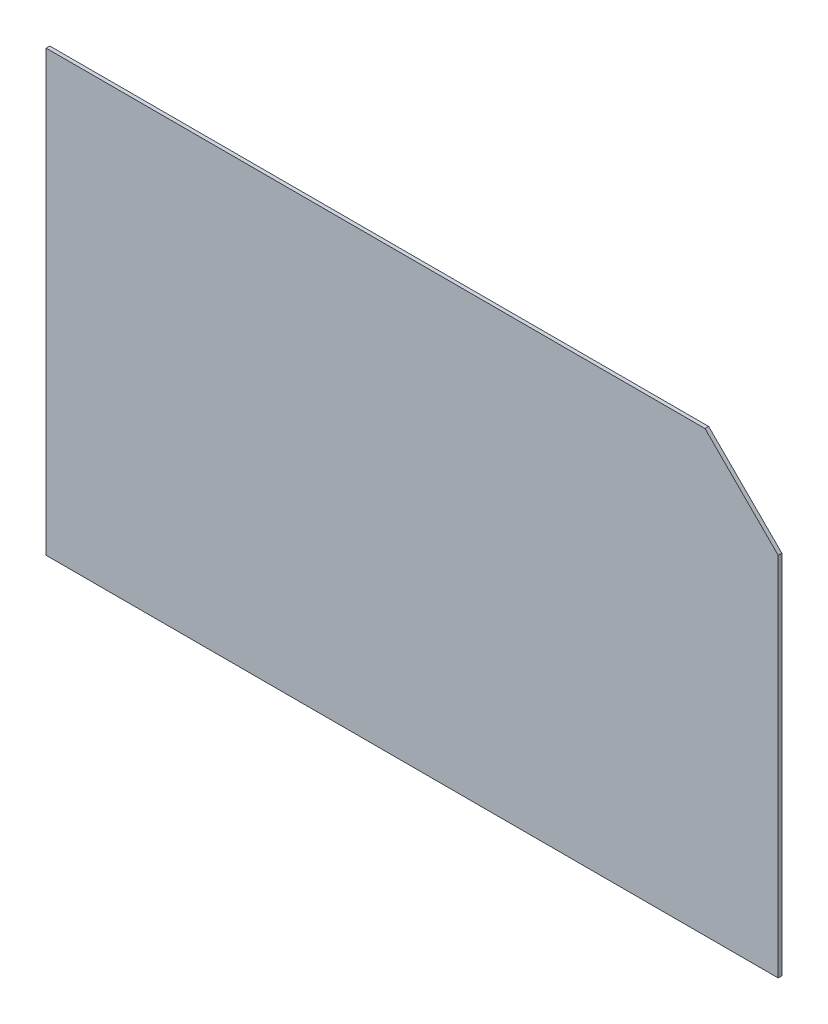
ISO-10303-21;
HEADER;
FILE_DESCRIPTION(('STEP AP214'),'2;1');
FILE_NAME('part.step','',(''),(''),'','','');
FILE_SCHEMA(('AUTOMOTIVE_DESIGN { 1 0 10303 214 1 1 1 1 }'));
ENDSEC;
DATA;
#1=APPLICATION_CONTEXT('core data for automotive mechanical design processes');
#2=APPLICATION_PROTOCOL_DEFINITION('international standard','automotive_design',2000,#1);
#3=PRODUCT_CONTEXT('',#1,'mechanical');
#4=PRODUCT('Part','Part','',(#3));
#5=PRODUCT_RELATED_PRODUCT_CATEGORY('part','',(#4));
#6=PRODUCT_DEFINITION_FORMATION('','',#4);
#7=PRODUCT_DEFINITION_CONTEXT('part definition',#1,'design');
#8=PRODUCT_DEFINITION('design','',#6,#7);
#9=PRODUCT_DEFINITION_SHAPE('','',#8);
#10=(LENGTH_UNIT() NAMED_UNIT(*) SI_UNIT(.MILLI.,.METRE.));
#11=(NAMED_UNIT(*) PLANE_ANGLE_UNIT() SI_UNIT($,.RADIAN.));
#12=(NAMED_UNIT(*) SI_UNIT($,.STERADIAN.) SOLID_ANGLE_UNIT());
#13=UNCERTAINTY_MEASURE_WITH_UNIT(LENGTH_MEASURE(1.E-05),#10,'distance_accuracy_value','');
#14=(GEOMETRIC_REPRESENTATION_CONTEXT(3) GLOBAL_UNCERTAINTY_ASSIGNED_CONTEXT((#13)) GLOBAL_UNIT_ASSIGNED_CONTEXT((#10,
#11,#12)) REPRESENTATION_CONTEXT('',''));
#15=CARTESIAN_POINT('',(0.,0.,0.));
#16=DIRECTION('',(0.,0.,1.));
#17=DIRECTION('',(1.,0.,0.));
#18=AXIS2_PLACEMENT_3D('',#15,#16,#17);
#19=CARTESIAN_POINT('',(-2105.89651022864,2647.412755716,-25.));
#20=DIRECTION('',(-1.,0.,0.));
#21=DIRECTION('',(0.,-1.,0.));
#22=AXIS2_PLACEMENT_3D('',#19,#20,#21);
#23=PLANE('',#22);
#24=DIRECTION('',(0.,-1.,0.));
#25=VECTOR('',#24,1.);
#26=CARTESIAN_POINT('',(-2105.89651022864,2647.412755716,0.));
#27=LINE('',#26,#25);
#28=CARTESIAN_POINT('',(-2105.89651022864,2647.412755716,0.));
#29=VERTEX_POINT('',#28);
#30=CARTESIAN_POINT('',(-2105.89651022864,-352.587244283995,0.));
#31=VERTEX_POINT('',#30);
#32=EDGE_CURVE('E119',#29,#31,#27,.T.);
#33=ORIENTED_EDGE('',*,*,#32,.F.);
#34=DIRECTION('',(0.,0.,1.));
#35=VECTOR('',#34,1.);
#36=CARTESIAN_POINT('',(-2105.89651022864,2647.412755716,-25.));
#37=LINE('',#36,#35);
#38=CARTESIAN_POINT('',(-2105.89651022864,2647.412755716,-25.));
#39=VERTEX_POINT('',#38);
#40=EDGE_CURVE('E11',#39,#29,#37,.T.);
#41=ORIENTED_EDGE('',*,*,#40,.F.);
#42=DIRECTION('',(0.,-1.,0.));
#43=VECTOR('',#42,1.);
#44=CARTESIAN_POINT('',(-2105.89651022864,2647.412755716,-25.));
#45=LINE('',#44,#43);
#46=CARTESIAN_POINT('',(-2105.89651022864,-352.587244283995,-25.));
#47=VERTEX_POINT('',#46);
#48=EDGE_CURVE('E117',#39,#47,#45,.T.);
#49=ORIENTED_EDGE('',*,*,#48,.T.);
#50=DIRECTION('',(0.,0.,1.));
#51=VECTOR('',#50,1.);
#52=CARTESIAN_POINT('',(-2105.89651022864,-352.587244283995,-25.));
#53=LINE('',#52,#51);
#54=EDGE_CURVE('E42',#47,#31,#53,.T.);
#55=ORIENTED_EDGE('',*,*,#54,.T.);
#56=EDGE_LOOP('',(#33,#41,#49,#55));
#57=FACE_BOUND('',#56,.T.);
#58=ADVANCED_FACE('F39',(#57),#23,.T.);
#59=CARTESIAN_POINT('',(-2105.89651022864,2647.412755716,-25.));
#60=DIRECTION('',(0.,1.,0.));
#61=DIRECTION('',(0.,0.,1.));
#62=AXIS2_PLACEMENT_3D('',#59,#60,#61);
#63=PLANE('',#62);
#64=DIRECTION('',(0.,0.,1.));
#65=VECTOR('',#64,1.);
#66=CARTESIAN_POINT('',(2394.10348977136,2647.412755716,-932.));
#67=LINE('',#66,#65);
#68=CARTESIAN_POINT('',(2394.10348977136,2647.412755716,-25.));
#69=VERTEX_POINT('',#68);
#70=CARTESIAN_POINT('',(2394.10348977136,2647.412755716,0.));
#71=VERTEX_POINT('',#70);
#72=EDGE_CURVE('E56',#69,#71,#67,.T.);
#73=ORIENTED_EDGE('',*,*,#72,.F.);
#74=DIRECTION('',(-1.,0.,0.));
#75=VECTOR('',#74,1.);
#76=CARTESIAN_POINT('',(-2105.89651022864,2647.412755716,-25.));
#77=LINE('',#76,#75);
#78=EDGE_CURVE('E63',#69,#39,#77,.T.);
#79=ORIENTED_EDGE('',*,*,#78,.T.);
#80=ORIENTED_EDGE('',*,*,#40,.T.);
#81=DIRECTION('',(-1.,0.,0.));
#82=VECTOR('',#81,1.);
#83=CARTESIAN_POINT('',(-2105.89651022864,2647.412755716,0.));
#84=LINE('',#83,#82);
#85=EDGE_CURVE('E81',#71,#29,#84,.T.);
#86=ORIENTED_EDGE('',*,*,#85,.F.);
#87=EDGE_LOOP('',(#73,#79,#80,#86));
#88=FACE_BOUND('',#87,.T.);
#89=ADVANCED_FACE('F146',(#88),#63,.T.);
#90=CARTESIAN_POINT('',(2894.10348977136,2647.412755716,-25.));
#91=DIRECTION('',(1.,0.,0.));
#92=DIRECTION('',(0.,0.,-1.));
#93=AXIS2_PLACEMENT_3D('',#90,#91,#92);
#94=PLANE('',#93);
#95=DIRECTION('',(0.,0.,1.));
#96=VECTOR('',#95,1.);
#97=CARTESIAN_POINT('',(2894.10348977136,2147.412755716,-932.));
#98=LINE('',#97,#96);
#99=CARTESIAN_POINT('',(2894.10348977136,2147.412755716,-25.));
#100=VERTEX_POINT('',#99);
#101=CARTESIAN_POINT('',(2894.10348977136,2147.412755716,0.));
#102=VERTEX_POINT('',#101);
#103=EDGE_CURVE('E96',#100,#102,#98,.T.);
#104=ORIENTED_EDGE('',*,*,#103,.T.);
#105=DIRECTION('',(0.,1.,0.));
#106=VECTOR('',#105,1.);
#107=CARTESIAN_POINT('',(2894.10348977136,2647.412755716,0.));
#108=LINE('',#107,#106);
#109=CARTESIAN_POINT('',(2894.10348977136,-352.587244283995,0.));
#110=VERTEX_POINT('',#109);
#111=EDGE_CURVE('E105',#110,#102,#108,.T.);
#112=ORIENTED_EDGE('',*,*,#111,.F.);
#113=DIRECTION('',(0.,0.,1.));
#114=VECTOR('',#113,1.);
#115=CARTESIAN_POINT('',(2894.10348977136,-352.587244283995,-25.));
#116=LINE('',#115,#114);
#117=CARTESIAN_POINT('',(2894.10348977136,-352.587244283995,-25.));
#118=VERTEX_POINT('',#117);
#119=EDGE_CURVE('E48',#118,#110,#116,.T.);
#120=ORIENTED_EDGE('',*,*,#119,.F.);
#121=DIRECTION('',(0.,1.,0.));
#122=VECTOR('',#121,1.);
#123=CARTESIAN_POINT('',(2894.10348977136,2647.412755716,-25.));
#124=LINE('',#123,#122);
#125=EDGE_CURVE('E108',#118,#100,#124,.T.);
#126=ORIENTED_EDGE('',*,*,#125,.T.);
#127=EDGE_LOOP('',(#104,#112,#120,#126));
#128=FACE_BOUND('',#127,.T.);
#129=ADVANCED_FACE('F104',(#128),#94,.T.);
#130=CARTESIAN_POINT('',(-2105.89651022864,-352.587244283995,-25.));
#131=DIRECTION('',(0.,-1.,0.));
#132=DIRECTION('',(0.,0.,-1.));
#133=AXIS2_PLACEMENT_3D('',#130,#131,#132);
#134=PLANE('',#133);
#135=DIRECTION('',(1.,0.,0.));
#136=VECTOR('',#135,1.);
#137=CARTESIAN_POINT('',(-2105.89651022864,-352.587244283995,0.));
#138=LINE('',#137,#136);
#139=EDGE_CURVE('E112',#31,#110,#138,.T.);
#140=ORIENTED_EDGE('',*,*,#139,.F.);
#141=ORIENTED_EDGE('',*,*,#54,.F.);
#142=DIRECTION('',(1.,0.,0.));
#143=VECTOR('',#142,1.);
#144=CARTESIAN_POINT('',(-2105.89651022864,-352.587244283995,-25.));
#145=LINE('',#144,#143);
#146=EDGE_CURVE('E130',#47,#118,#145,.T.);
#147=ORIENTED_EDGE('',*,*,#146,.T.);
#148=ORIENTED_EDGE('',*,*,#119,.T.);
#149=EDGE_LOOP('',(#140,#141,#147,#148));
#150=FACE_BOUND('',#149,.T.);
#151=ADVANCED_FACE('F143',(#150),#134,.T.);
#152=CARTESIAN_POINT('',(0.,0.,-25.));
#153=DIRECTION('',(0.,0.,1.));
#154=DIRECTION('',(1.,0.,0.));
#155=AXIS2_PLACEMENT_3D('',#152,#153,#154);
#156=PLANE('',#155);
#157=ORIENTED_EDGE('',*,*,#78,.F.);
#158=DIRECTION('',(0.707106781186544,-0.707106781186551,0.));
#159=VECTOR('',#158,1.);
#160=CARTESIAN_POINT('',(2520.7581227437,2520.75812274367,-25.));
#161=LINE('',#160,#159);
#162=EDGE_CURVE('E134',#69,#100,#161,.T.);
#163=ORIENTED_EDGE('',*,*,#162,.T.);
#164=ORIENTED_EDGE('',*,*,#125,.F.);
#165=ORIENTED_EDGE('',*,*,#146,.F.);
#166=ORIENTED_EDGE('',*,*,#48,.F.);
#167=EDGE_LOOP('',(#157,#163,#164,#165,#166));
#168=FACE_BOUND('',#167,.T.);
#169=ADVANCED_FACE('F145',(#168),#156,.F.);
#170=CARTESIAN_POINT('',(0.,0.,0.));
#171=DIRECTION('',(0.,0.,1.));
#172=DIRECTION('',(1.,0.,0.));
#173=AXIS2_PLACEMENT_3D('',#170,#171,#172);
#174=PLANE('',#173);
#175=DIRECTION('',(0.707106781186544,-0.707106781186551,0.));
#176=VECTOR('',#175,1.);
#177=CARTESIAN_POINT('',(2394.10348977136,2647.412755716,0.));
#178=LINE('',#177,#176);
#179=EDGE_CURVE('E93',#71,#102,#178,.T.);
#180=ORIENTED_EDGE('',*,*,#179,.F.);
#181=ORIENTED_EDGE('',*,*,#85,.T.);
#182=ORIENTED_EDGE('',*,*,#32,.T.);
#183=ORIENTED_EDGE('',*,*,#139,.T.);
#184=ORIENTED_EDGE('',*,*,#111,.T.);
#185=EDGE_LOOP('',(#180,#181,#182,#183,#184));
#186=FACE_BOUND('',#185,.T.);
#187=ADVANCED_FACE('F111',(#186),#174,.T.);
#188=CARTESIAN_POINT('',(2394.10348977136,2647.412755716,-932.));
#189=DIRECTION('',(-0.707106781186551,-0.707106781186544,0.));
#190=DIRECTION('',(0.707106781186544,-0.707106781186551,0.));
#191=AXIS2_PLACEMENT_3D('',#188,#189,#190);
#192=PLANE('',#191);
#193=ORIENTED_EDGE('',*,*,#72,.T.);
#194=ORIENTED_EDGE('',*,*,#179,.T.);
#195=ORIENTED_EDGE('',*,*,#103,.F.);
#196=ORIENTED_EDGE('',*,*,#162,.F.);
#197=EDGE_LOOP('',(#193,#194,#195,#196));
#198=FACE_BOUND('',#197,.T.);
#199=ADVANCED_FACE('F95',(#198),#192,.F.);
#200=CLOSED_SHELL('',(#58,#89,#129,#151,#169,#187,#199));
#201=MANIFOLD_SOLID_BREP('B2',#200);
#202=ADVANCED_BREP_SHAPE_REPRESENTATION('',(#18,#201),#14);
#203=SHAPE_DEFINITION_REPRESENTATION(#9,#202);
ENDSEC;
END-ISO-10303-21;
